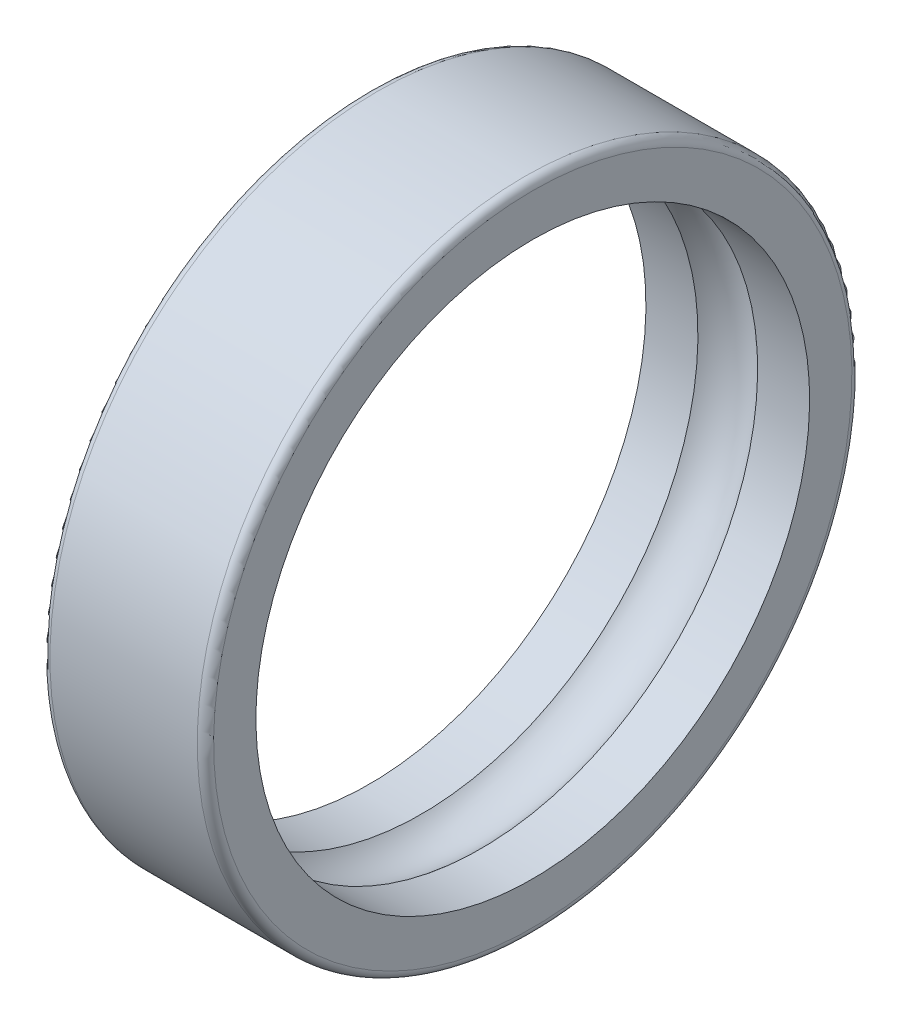
ISO-10303-21;
HEADER;
FILE_DESCRIPTION(('STEP AP214'),'2;1');
FILE_NAME('part.step','',(''),(''),'','','');
FILE_SCHEMA(('AUTOMOTIVE_DESIGN { 1 0 10303 214 1 1 1 1 }'));
ENDSEC;
DATA;
#1=APPLICATION_CONTEXT('core data for automotive mechanical design processes');
#2=APPLICATION_PROTOCOL_DEFINITION('international standard','automotive_design',2000,#1);
#3=PRODUCT_CONTEXT('',#1,'mechanical');
#4=PRODUCT('Part','Part','',(#3));
#5=PRODUCT_RELATED_PRODUCT_CATEGORY('part','',(#4));
#6=PRODUCT_DEFINITION_FORMATION('','',#4);
#7=PRODUCT_DEFINITION_CONTEXT('part definition',#1,'design');
#8=PRODUCT_DEFINITION('design','',#6,#7);
#9=PRODUCT_DEFINITION_SHAPE('','',#8);
#10=(LENGTH_UNIT() NAMED_UNIT(*) SI_UNIT(.MILLI.,.METRE.));
#11=(NAMED_UNIT(*) PLANE_ANGLE_UNIT() SI_UNIT($,.RADIAN.));
#12=(NAMED_UNIT(*) SI_UNIT($,.STERADIAN.) SOLID_ANGLE_UNIT());
#13=UNCERTAINTY_MEASURE_WITH_UNIT(LENGTH_MEASURE(1.E-05),#10,'distance_accuracy_value','');
#14=(GEOMETRIC_REPRESENTATION_CONTEXT(3) GLOBAL_UNCERTAINTY_ASSIGNED_CONTEXT((#13)) GLOBAL_UNIT_ASSIGNED_CONTEXT((#10,
#11,#12)) REPRESENTATION_CONTEXT('',''));
#15=CARTESIAN_POINT('',(0.,0.,0.));
#16=DIRECTION('',(0.,0.,1.));
#17=DIRECTION('',(1.,0.,0.));
#18=AXIS2_PLACEMENT_3D('',#15,#16,#17);
#19=CARTESIAN_POINT('',(5.04718741076527,0.,0.));
#20=DIRECTION('',(-1.,0.,0.));
#21=DIRECTION('',(0.,1.,0.));
#22=AXIS2_PLACEMENT_3D('',#19,#20,#21);
#23=CYLINDRICAL_SURFACE('',#22,10.15);
#24=CARTESIAN_POINT('',(6.,0.,0.));
#25=DIRECTION('',(1.,0.,0.));
#26=DIRECTION('',(0.,1.,0.));
#27=AXIS2_PLACEMENT_3D('',#24,#25,#26);
#28=CIRCLE('',#27,10.15);
#29=CARTESIAN_POINT('',(6.,10.15,0.));
#30=VERTEX_POINT('',#29);
#31=EDGE_CURVE('E10',#30,#30,#28,.T.);
#32=ORIENTED_EDGE('',*,*,#31,.T.);
#33=EDGE_LOOP('',(#32));
#34=FACE_BOUND('',#33,.T.);
#35=CARTESIAN_POINT('',(4.09437482153054,0.,0.));
#36=DIRECTION('',(1.,0.,0.));
#37=DIRECTION('',(0.,1.,0.));
#38=AXIS2_PLACEMENT_3D('',#35,#36,#37);
#39=CIRCLE('',#38,10.15);
#40=CARTESIAN_POINT('',(4.09437482153054,10.15,0.));
#41=VERTEX_POINT('',#40);
#42=EDGE_CURVE('E50',#41,#41,#39,.T.);
#43=ORIENTED_EDGE('',*,*,#42,.F.);
#44=EDGE_LOOP('',(#43));
#45=FACE_BOUND('',#44,.T.);
#46=ADVANCED_FACE('F15',(#34,#45),#23,.F.);
#47=CARTESIAN_POINT('',(6.,10.925,0.));
#48=DIRECTION('',(1.,0.,0.));
#49=DIRECTION('',(0.,1.,0.));
#50=AXIS2_PLACEMENT_3D('',#47,#48,#49);
#51=PLANE('',#50);
#52=CARTESIAN_POINT('',(6.,0.,0.));
#53=DIRECTION('',(1.,0.,0.));
#54=DIRECTION('',(0.,1.,0.));
#55=AXIS2_PLACEMENT_3D('',#52,#53,#54);
#56=CIRCLE('',#55,11.7);
#57=CARTESIAN_POINT('',(6.,11.7,0.));
#58=VERTEX_POINT('',#57);
#59=EDGE_CURVE('E24',#58,#58,#56,.T.);
#60=ORIENTED_EDGE('',*,*,#59,.T.);
#61=EDGE_LOOP('',(#60));
#62=FACE_BOUND('',#61,.T.);
#63=ORIENTED_EDGE('',*,*,#31,.F.);
#64=EDGE_LOOP('',(#63));
#65=FACE_BOUND('',#64,.T.);
#66=ADVANCED_FACE('F83',(#62,#65),#51,.T.);
#67=CARTESIAN_POINT('',(5.7,0.,0.));
#68=DIRECTION('',(1.,0.,0.));
#69=DIRECTION('',(0.,0.,-1.));
#70=AXIS2_PLACEMENT_3D('',#67,#68,#69);
#71=TOROIDAL_SURFACE('',#70,11.7,0.3);
#72=CARTESIAN_POINT('',(5.7,0.,0.));
#73=DIRECTION('',(1.,0.,0.));
#74=DIRECTION('',(0.,1.,0.));
#75=AXIS2_PLACEMENT_3D('',#72,#73,#74);
#76=CIRCLE('',#75,12.);
#77=CARTESIAN_POINT('',(5.7,12.,0.));
#78=VERTEX_POINT('',#77);
#79=EDGE_CURVE('E18',#78,#78,#76,.T.);
#80=ORIENTED_EDGE('',*,*,#79,.T.);
#81=EDGE_LOOP('',(#80));
#82=FACE_BOUND('',#81,.T.);
#83=ORIENTED_EDGE('',*,*,#59,.F.);
#84=EDGE_LOOP('',(#83));
#85=FACE_BOUND('',#84,.T.);
#86=ADVANCED_FACE('F55',(#82,#85),#71,.T.);
#87=CARTESIAN_POINT('',(3.,0.,0.));
#88=DIRECTION('',(-1.,0.,0.));
#89=DIRECTION('',(0.,1.,0.));
#90=AXIS2_PLACEMENT_3D('',#87,#88,#89);
#91=CYLINDRICAL_SURFACE('',#90,12.);
#92=CARTESIAN_POINT('',(0.3,0.,0.));
#93=DIRECTION('',(1.,0.,0.));
#94=DIRECTION('',(0.,1.,0.));
#95=AXIS2_PLACEMENT_3D('',#92,#93,#94);
#96=CIRCLE('',#95,12.);
#97=CARTESIAN_POINT('',(0.3,12.,0.));
#98=VERTEX_POINT('',#97);
#99=EDGE_CURVE('E58',#98,#98,#96,.T.);
#100=ORIENTED_EDGE('',*,*,#99,.T.);
#101=EDGE_LOOP('',(#100));
#102=FACE_BOUND('',#101,.T.);
#103=ORIENTED_EDGE('',*,*,#79,.F.);
#104=EDGE_LOOP('',(#103));
#105=FACE_BOUND('',#104,.T.);
#106=ADVANCED_FACE('F92',(#102,#105),#91,.T.);
#107=CARTESIAN_POINT('',(0.3,0.,0.));
#108=DIRECTION('',(1.,0.,0.));
#109=DIRECTION('',(0.,0.,-1.));
#110=AXIS2_PLACEMENT_3D('',#107,#108,#109);
#111=TOROIDAL_SURFACE('',#110,11.7,0.3);
#112=CARTESIAN_POINT('',(0.,0.,0.));
#113=DIRECTION('',(1.,0.,0.));
#114=DIRECTION('',(0.,1.,0.));
#115=AXIS2_PLACEMENT_3D('',#112,#113,#114);
#116=CIRCLE('',#115,11.7);
#117=CARTESIAN_POINT('',(0.,11.7,0.));
#118=VERTEX_POINT('',#117);
#119=EDGE_CURVE('E59',#118,#118,#116,.T.);
#120=ORIENTED_EDGE('',*,*,#119,.T.);
#121=EDGE_LOOP('',(#120));
#122=FACE_BOUND('',#121,.T.);
#123=ORIENTED_EDGE('',*,*,#99,.F.);
#124=EDGE_LOOP('',(#123));
#125=FACE_BOUND('',#124,.T.);
#126=ADVANCED_FACE('F99',(#122,#125),#111,.T.);
#127=CARTESIAN_POINT('',(0.,10.925,0.));
#128=DIRECTION('',(-1.,0.,0.));
#129=DIRECTION('',(0.,-1.,0.));
#130=AXIS2_PLACEMENT_3D('',#127,#128,#129);
#131=PLANE('',#130);
#132=CARTESIAN_POINT('',(0.,0.,0.));
#133=DIRECTION('',(1.,0.,0.));
#134=DIRECTION('',(0.,1.,0.));
#135=AXIS2_PLACEMENT_3D('',#132,#133,#134);
#136=CIRCLE('',#135,10.15);
#137=CARTESIAN_POINT('',(0.,10.15,0.));
#138=VERTEX_POINT('',#137);
#139=EDGE_CURVE('E45',#138,#138,#136,.T.);
#140=ORIENTED_EDGE('',*,*,#139,.T.);
#141=EDGE_LOOP('',(#140));
#142=FACE_BOUND('',#141,.T.);
#143=ORIENTED_EDGE('',*,*,#119,.F.);
#144=EDGE_LOOP('',(#143));
#145=FACE_BOUND('',#144,.T.);
#146=ADVANCED_FACE('F80',(#142,#145),#131,.T.);
#147=CARTESIAN_POINT('',(0.95281258923473,0.,0.));
#148=DIRECTION('',(-1.,0.,0.));
#149=DIRECTION('',(0.,1.,0.));
#150=AXIS2_PLACEMENT_3D('',#147,#148,#149);
#151=CYLINDRICAL_SURFACE('',#150,10.15);
#152=CARTESIAN_POINT('',(1.90562517846946,0.,0.));
#153=DIRECTION('',(1.,0.,0.));
#154=DIRECTION('',(0.,1.,0.));
#155=AXIS2_PLACEMENT_3D('',#152,#153,#154);
#156=CIRCLE('',#155,10.15);
#157=CARTESIAN_POINT('',(1.90562517846946,10.15,0.));
#158=VERTEX_POINT('',#157);
#159=EDGE_CURVE('E65',#158,#158,#156,.T.);
#160=ORIENTED_EDGE('',*,*,#159,.T.);
#161=EDGE_LOOP('',(#160));
#162=FACE_BOUND('',#161,.T.);
#163=ORIENTED_EDGE('',*,*,#139,.F.);
#164=EDGE_LOOP('',(#163));
#165=FACE_BOUND('',#164,.T.);
#166=ADVANCED_FACE('F70',(#162,#165),#151,.F.);
#167=CARTESIAN_POINT('',(3.,0.,0.));
#168=DIRECTION('',(1.,0.,0.));
#169=DIRECTION('',(0.,0.,-1.));
#170=AXIS2_PLACEMENT_3D('',#167,#168,#169);
#171=TOROIDAL_SURFACE('',#170,9.,1.5875);
#172=ORIENTED_EDGE('',*,*,#42,.T.);
#173=EDGE_LOOP('',(#172));
#174=FACE_BOUND('',#173,.T.);
#175=ORIENTED_EDGE('',*,*,#159,.F.);
#176=EDGE_LOOP('',(#175));
#177=FACE_BOUND('',#176,.T.);
#178=ADVANCED_FACE('F73',(#174,#177),#171,.F.);
#179=CLOSED_SHELL('',(#46,#66,#86,#106,#126,#146,#166,#178));
#180=MANIFOLD_SOLID_BREP('B1',#179);
#181=ADVANCED_BREP_SHAPE_REPRESENTATION('',(#18,#180),#14);
#182=SHAPE_DEFINITION_REPRESENTATION(#9,#181);
ENDSEC;
END-ISO-10303-21;
